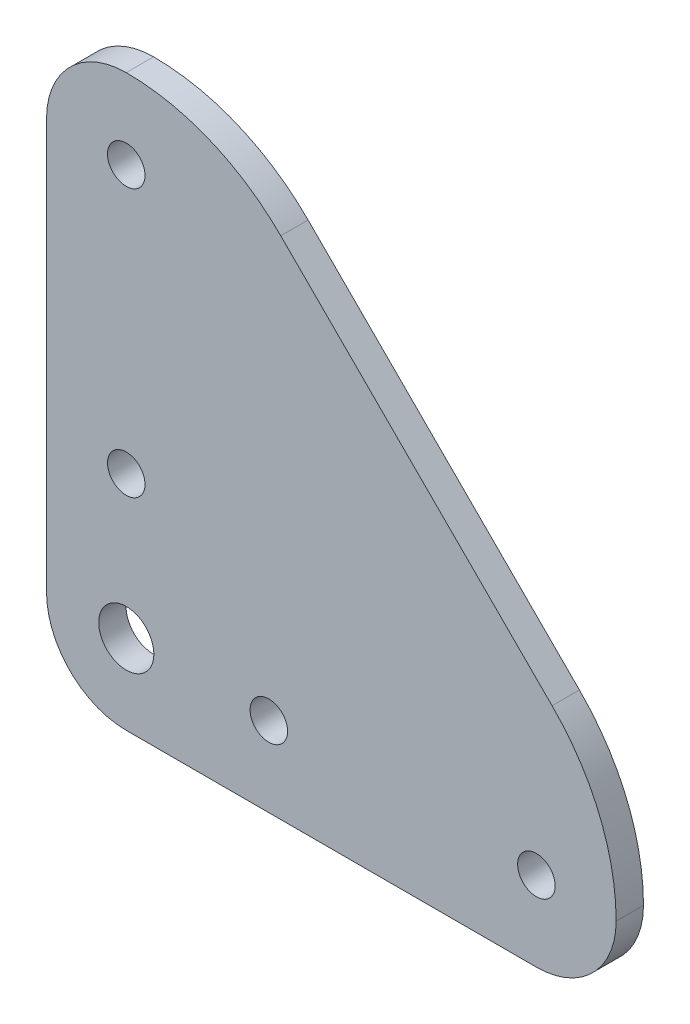
ISO-10303-21;
HEADER;
FILE_DESCRIPTION(('STEP AP214'),'2;1');
FILE_NAME('part.step','',(''),(''),'','','');
FILE_SCHEMA(('AUTOMOTIVE_DESIGN { 1 0 10303 214 1 1 1 1 }'));
ENDSEC;
DATA;
#1=APPLICATION_CONTEXT('core data for automotive mechanical design processes');
#2=APPLICATION_PROTOCOL_DEFINITION('international standard','automotive_design',2000,#1);
#3=PRODUCT_CONTEXT('',#1,'mechanical');
#4=PRODUCT('Part','Part','',(#3));
#5=PRODUCT_RELATED_PRODUCT_CATEGORY('part','',(#4));
#6=PRODUCT_DEFINITION_FORMATION('','',#4);
#7=PRODUCT_DEFINITION_CONTEXT('part definition',#1,'design');
#8=PRODUCT_DEFINITION('design','',#6,#7);
#9=PRODUCT_DEFINITION_SHAPE('','',#8);
#10=(LENGTH_UNIT() NAMED_UNIT(*) SI_UNIT(.MILLI.,.METRE.));
#11=(NAMED_UNIT(*) PLANE_ANGLE_UNIT() SI_UNIT($,.RADIAN.));
#12=(NAMED_UNIT(*) SI_UNIT($,.STERADIAN.) SOLID_ANGLE_UNIT());
#13=UNCERTAINTY_MEASURE_WITH_UNIT(LENGTH_MEASURE(1.E-05),#10,'distance_accuracy_value','');
#14=(GEOMETRIC_REPRESENTATION_CONTEXT(3) GLOBAL_UNCERTAINTY_ASSIGNED_CONTEXT((#13)) GLOBAL_UNIT_ASSIGNED_CONTEXT((#10,
#11,#12)) REPRESENTATION_CONTEXT('',''));
#15=CARTESIAN_POINT('',(0.,0.,0.));
#16=DIRECTION('',(0.,0.,1.));
#17=DIRECTION('',(1.,0.,0.));
#18=AXIS2_PLACEMENT_3D('',#15,#16,#17);
#19=CARTESIAN_POINT('',(0.,0.,3.));
#20=DIRECTION('',(0.,0.,-1.));
#21=DIRECTION('',(-1.,0.,0.));
#22=AXIS2_PLACEMENT_3D('',#19,#20,#21);
#23=PLANE('',#22);
#24=CARTESIAN_POINT('',(52.7884,21.5,3.));
#25=DIRECTION('',(0.,0.,1.));
#26=DIRECTION('',(1.,0.,0.));
#27=AXIS2_PLACEMENT_3D('',#24,#25,#26);
#28=CIRCLE('',#27,4.11875000000001);
#29=CARTESIAN_POINT('',(56.90715,21.5,3.));
#30=VERTEX_POINT('',#29);
#31=EDGE_CURVE('E172',#30,#30,#28,.T.);
#32=ORIENTED_EDGE('',*,*,#31,.F.);
#33=EDGE_LOOP('',(#32));
#34=FACE_BOUND('',#33,.T.);
#35=CARTESIAN_POINT('',(21.5,111.5,3.));
#36=DIRECTION('',(0.,0.,1.));
#37=DIRECTION('',(1.,0.,0.));
#38=AXIS2_PLACEMENT_3D('',#35,#36,#37);
#39=CIRCLE('',#38,4.11875);
#40=CARTESIAN_POINT('',(25.61875,111.5,3.));
#41=VERTEX_POINT('',#40);
#42=EDGE_CURVE('E178',#41,#41,#39,.T.);
#43=ORIENTED_EDGE('',*,*,#42,.F.);
#44=EDGE_LOOP('',(#43));
#45=FACE_BOUND('',#44,.T.);
#46=CARTESIAN_POINT('',(21.5,52.7884,3.));
#47=DIRECTION('',(0.,0.,1.));
#48=DIRECTION('',(1.,0.,0.));
#49=AXIS2_PLACEMENT_3D('',#46,#47,#48);
#50=CIRCLE('',#49,4.11875);
#51=CARTESIAN_POINT('',(25.61875,52.7884,3.));
#52=VERTEX_POINT('',#51);
#53=EDGE_CURVE('E184',#52,#52,#50,.T.);
#54=ORIENTED_EDGE('',*,*,#53,.F.);
#55=EDGE_LOOP('',(#54));
#56=FACE_BOUND('',#55,.T.);
#57=CARTESIAN_POINT('',(111.5,21.5,3.));
#58=DIRECTION('',(0.,0.,1.));
#59=DIRECTION('',(1.,0.,0.));
#60=AXIS2_PLACEMENT_3D('',#57,#58,#59);
#61=CIRCLE('',#60,4.11875000000001);
#62=CARTESIAN_POINT('',(115.61875,21.5,3.));
#63=VERTEX_POINT('',#62);
#64=EDGE_CURVE('E190',#63,#63,#61,.T.);
#65=ORIENTED_EDGE('',*,*,#64,.F.);
#66=EDGE_LOOP('',(#65));
#67=FACE_BOUND('',#66,.T.);
#68=CARTESIAN_POINT('',(21.5,21.5,3.));
#69=DIRECTION('',(0.,0.,1.));
#70=DIRECTION('',(1.,0.,0.));
#71=AXIS2_PLACEMENT_3D('',#68,#69,#70);
#72=CIRCLE('',#71,6.05);
#73=CARTESIAN_POINT('',(27.55,21.5,3.));
#74=VERTEX_POINT('',#73);
#75=EDGE_CURVE('E11',#74,#74,#72,.T.);
#76=ORIENTED_EDGE('',*,*,#75,.F.);
#77=EDGE_LOOP('',(#76));
#78=FACE_BOUND('',#77,.T.);
#79=CARTESIAN_POINT('',(111.5,21.5,3.));
#80=DIRECTION('',(0.,0.,1.));
#81=DIRECTION('',(1.,0.,0.));
#82=AXIS2_PLACEMENT_3D('',#79,#80,#81);
#83=CIRCLE('',#82,17.5);
#84=CARTESIAN_POINT('',(111.5,4.00000000000001,3.));
#85=VERTEX_POINT('',#84);
#86=CARTESIAN_POINT('',(128.999999939322,21.4985426940124,3.));
#87=VERTEX_POINT('',#86);
#88=EDGE_CURVE('E140',#85,#87,#83,.T.);
#89=ORIENTED_EDGE('',*,*,#88,.T.);
#90=CARTESIAN_POINT('',(81.0000147151093,21.4608800414897,3.));
#91=DIRECTION('',(0.,0.,1.));
#92=DIRECTION('',(1.,0.,0.));
#93=AXIS2_PLACEMENT_3D('',#90,#91,#92);
#94=CIRCLE('',#93,48.);
#95=CARTESIAN_POINT('',(114.941140212064,55.402005538444,3.));
#96=VERTEX_POINT('',#95);
#97=EDGE_CURVE('E143',#87,#96,#94,.T.);
#98=ORIENTED_EDGE('',*,*,#97,.T.);
#99=DIRECTION('',(-0.707106781186547,0.707106781186548,0.));
#100=VECTOR('',#99,1.);
#101=CARTESIAN_POINT('',(114.941140212064,55.402005538444,3.));
#102=LINE('',#101,#100);
#103=CARTESIAN_POINT('',(55.402005538444,114.941140212064,3.));
#104=VERTEX_POINT('',#103);
#105=EDGE_CURVE('E54',#96,#104,#102,.T.);
#106=ORIENTED_EDGE('',*,*,#105,.T.);
#107=CARTESIAN_POINT('',(21.4608800414897,81.0000147151093,3.));
#108=DIRECTION('',(0.,0.,1.));
#109=DIRECTION('',(1.,0.,0.));
#110=AXIS2_PLACEMENT_3D('',#107,#108,#109);
#111=CIRCLE('',#110,48.);
#112=CARTESIAN_POINT('',(21.4985426940171,128.999999939322,3.));
#113=VERTEX_POINT('',#112);
#114=EDGE_CURVE('E111',#104,#113,#111,.T.);
#115=ORIENTED_EDGE('',*,*,#114,.T.);
#116=CARTESIAN_POINT('',(21.5,111.5,3.));
#117=DIRECTION('',(0.,0.,1.));
#118=DIRECTION('',(1.,0.,0.));
#119=AXIS2_PLACEMENT_3D('',#116,#117,#118);
#120=CIRCLE('',#119,17.5);
#121=CARTESIAN_POINT('',(4.,111.5,3.));
#122=VERTEX_POINT('',#121);
#123=EDGE_CURVE('E148',#113,#122,#120,.T.);
#124=ORIENTED_EDGE('',*,*,#123,.T.);
#125=DIRECTION('',(0.,-1.,0.));
#126=VECTOR('',#125,1.);
#127=CARTESIAN_POINT('',(4.,111.5,3.));
#128=LINE('',#127,#126);
#129=CARTESIAN_POINT('',(4.,21.5,3.));
#130=VERTEX_POINT('',#129);
#131=EDGE_CURVE('E151',#122,#130,#128,.T.);
#132=ORIENTED_EDGE('',*,*,#131,.T.);
#133=CARTESIAN_POINT('',(21.5,21.5,3.));
#134=DIRECTION('',(0.,0.,1.));
#135=DIRECTION('',(1.,0.,0.));
#136=AXIS2_PLACEMENT_3D('',#133,#134,#135);
#137=CIRCLE('',#136,17.5);
#138=CARTESIAN_POINT('',(21.5,4.,3.));
#139=VERTEX_POINT('',#138);
#140=EDGE_CURVE('E154',#130,#139,#137,.T.);
#141=ORIENTED_EDGE('',*,*,#140,.T.);
#142=DIRECTION('',(1.,0.,0.));
#143=VECTOR('',#142,1.);
#144=CARTESIAN_POINT('',(21.5,4.,3.));
#145=LINE('',#144,#143);
#146=EDGE_CURVE('E157',#139,#85,#145,.T.);
#147=ORIENTED_EDGE('',*,*,#146,.T.);
#148=EDGE_LOOP('',(#89,#98,#106,#115,#124,#132,#141,#147));
#149=FACE_BOUND('',#148,.T.);
#150=ADVANCED_FACE('F39',(#34,#45,#56,#67,#78,#149),#23,.F.);
#151=CARTESIAN_POINT('',(0.,0.,-3.));
#152=DIRECTION('',(0.,0.,-1.));
#153=DIRECTION('',(-1.,0.,0.));
#154=AXIS2_PLACEMENT_3D('',#151,#152,#153);
#155=PLANE('',#154);
#156=CARTESIAN_POINT('',(52.7884,21.5,-3.));
#157=DIRECTION('',(0.,0.,1.));
#158=DIRECTION('',(1.,0.,0.));
#159=AXIS2_PLACEMENT_3D('',#156,#157,#158);
#160=CIRCLE('',#159,4.11875000000001);
#161=CARTESIAN_POINT('',(56.90715,21.5,-3.));
#162=VERTEX_POINT('',#161);
#163=EDGE_CURVE('E162',#162,#162,#160,.T.);
#164=ORIENTED_EDGE('',*,*,#163,.T.);
#165=EDGE_LOOP('',(#164));
#166=FACE_BOUND('',#165,.T.);
#167=CARTESIAN_POINT('',(21.5,52.7884,-3.));
#168=DIRECTION('',(0.,0.,1.));
#169=DIRECTION('',(1.,0.,0.));
#170=AXIS2_PLACEMENT_3D('',#167,#168,#169);
#171=CIRCLE('',#170,4.11875);
#172=CARTESIAN_POINT('',(25.61875,52.7884,-3.));
#173=VERTEX_POINT('',#172);
#174=EDGE_CURVE('E181',#173,#173,#171,.T.);
#175=ORIENTED_EDGE('',*,*,#174,.T.);
#176=EDGE_LOOP('',(#175));
#177=FACE_BOUND('',#176,.T.);
#178=CARTESIAN_POINT('',(21.5,21.5,-3.));
#179=DIRECTION('',(0.,0.,1.));
#180=DIRECTION('',(1.,0.,0.));
#181=AXIS2_PLACEMENT_3D('',#178,#179,#180);
#182=CIRCLE('',#181,6.05);
#183=CARTESIAN_POINT('',(27.55,21.5,-3.));
#184=VERTEX_POINT('',#183);
#185=EDGE_CURVE('E43',#184,#184,#182,.T.);
#186=ORIENTED_EDGE('',*,*,#185,.T.);
#187=EDGE_LOOP('',(#186));
#188=FACE_BOUND('',#187,.T.);
#189=CARTESIAN_POINT('',(111.5,21.5,-3.));
#190=DIRECTION('',(0.,0.,1.));
#191=DIRECTION('',(1.,0.,0.));
#192=AXIS2_PLACEMENT_3D('',#189,#190,#191);
#193=CIRCLE('',#192,4.11875000000001);
#194=CARTESIAN_POINT('',(115.61875,21.5,-3.));
#195=VERTEX_POINT('',#194);
#196=EDGE_CURVE('E187',#195,#195,#193,.T.);
#197=ORIENTED_EDGE('',*,*,#196,.T.);
#198=EDGE_LOOP('',(#197));
#199=FACE_BOUND('',#198,.T.);
#200=CARTESIAN_POINT('',(21.5,111.5,-3.));
#201=DIRECTION('',(0.,0.,1.));
#202=DIRECTION('',(1.,0.,0.));
#203=AXIS2_PLACEMENT_3D('',#200,#201,#202);
#204=CIRCLE('',#203,4.11875);
#205=CARTESIAN_POINT('',(25.61875,111.5,-3.));
#206=VERTEX_POINT('',#205);
#207=EDGE_CURVE('E175',#206,#206,#204,.T.);
#208=ORIENTED_EDGE('',*,*,#207,.T.);
#209=EDGE_LOOP('',(#208));
#210=FACE_BOUND('',#209,.T.);
#211=CARTESIAN_POINT('',(81.0000147151093,21.4608800414897,-3.));
#212=DIRECTION('',(0.,0.,1.));
#213=DIRECTION('',(1.,0.,0.));
#214=AXIS2_PLACEMENT_3D('',#211,#212,#213);
#215=CIRCLE('',#214,48.);
#216=CARTESIAN_POINT('',(128.999999939322,21.4985426940124,-3.));
#217=VERTEX_POINT('',#216);
#218=CARTESIAN_POINT('',(114.941140212064,55.402005538444,-3.));
#219=VERTEX_POINT('',#218);
#220=EDGE_CURVE('E121',#217,#219,#215,.T.);
#221=ORIENTED_EDGE('',*,*,#220,.F.);
#222=CARTESIAN_POINT('',(111.5,21.5,-3.));
#223=DIRECTION('',(0.,0.,1.));
#224=DIRECTION('',(1.,0.,0.));
#225=AXIS2_PLACEMENT_3D('',#222,#223,#224);
#226=CIRCLE('',#225,17.5);
#227=CARTESIAN_POINT('',(111.5,4.00000000000001,-3.));
#228=VERTEX_POINT('',#227);
#229=EDGE_CURVE('E62',#228,#217,#226,.T.);
#230=ORIENTED_EDGE('',*,*,#229,.F.);
#231=DIRECTION('',(1.,0.,0.));
#232=VECTOR('',#231,1.);
#233=CARTESIAN_POINT('',(21.5,4.,-3.));
#234=LINE('',#233,#232);
#235=CARTESIAN_POINT('',(21.5,4.,-3.));
#236=VERTEX_POINT('',#235);
#237=EDGE_CURVE('E136',#236,#228,#234,.T.);
#238=ORIENTED_EDGE('',*,*,#237,.F.);
#239=CARTESIAN_POINT('',(21.5,21.5,-3.));
#240=DIRECTION('',(0.,0.,1.));
#241=DIRECTION('',(1.,0.,0.));
#242=AXIS2_PLACEMENT_3D('',#239,#240,#241);
#243=CIRCLE('',#242,17.5);
#244=CARTESIAN_POINT('',(4.,21.5,-3.));
#245=VERTEX_POINT('',#244);
#246=EDGE_CURVE('E133',#245,#236,#243,.T.);
#247=ORIENTED_EDGE('',*,*,#246,.F.);
#248=DIRECTION('',(0.,-1.,0.));
#249=VECTOR('',#248,1.);
#250=CARTESIAN_POINT('',(4.,111.5,-3.));
#251=LINE('',#250,#249);
#252=CARTESIAN_POINT('',(4.,111.5,-3.));
#253=VERTEX_POINT('',#252);
#254=EDGE_CURVE('E127',#253,#245,#251,.T.);
#255=ORIENTED_EDGE('',*,*,#254,.F.);
#256=CARTESIAN_POINT('',(21.5,111.5,-3.));
#257=DIRECTION('',(0.,0.,1.));
#258=DIRECTION('',(1.,0.,0.));
#259=AXIS2_PLACEMENT_3D('',#256,#257,#258);
#260=CIRCLE('',#259,17.5);
#261=CARTESIAN_POINT('',(21.4985426940171,128.999999939322,-3.));
#262=VERTEX_POINT('',#261);
#263=EDGE_CURVE('E125',#262,#253,#260,.T.);
#264=ORIENTED_EDGE('',*,*,#263,.F.);
#265=CARTESIAN_POINT('',(21.4608800414897,81.0000147151093,-3.));
#266=DIRECTION('',(0.,0.,1.));
#267=DIRECTION('',(1.,0.,0.));
#268=AXIS2_PLACEMENT_3D('',#265,#266,#267);
#269=CIRCLE('',#268,48.);
#270=CARTESIAN_POINT('',(55.402005538444,114.941140212064,-3.));
#271=VERTEX_POINT('',#270);
#272=EDGE_CURVE('E108',#271,#262,#269,.T.);
#273=ORIENTED_EDGE('',*,*,#272,.F.);
#274=DIRECTION('',(-0.707106781186547,0.707106781186548,0.));
#275=VECTOR('',#274,1.);
#276=CARTESIAN_POINT('',(114.941140212064,55.402005538444,-3.));
#277=LINE('',#276,#275);
#278=EDGE_CURVE('E116',#219,#271,#277,.T.);
#279=ORIENTED_EDGE('',*,*,#278,.F.);
#280=EDGE_LOOP('',(#221,#230,#238,#247,#255,#264,#273,#279));
#281=FACE_BOUND('',#280,.T.);
#282=ADVANCED_FACE('F41',(#166,#177,#188,#199,#210,#281),#155,.T.);
#283=CARTESIAN_POINT('',(21.5,21.5,3.));
#284=DIRECTION('',(0.,0.,-1.));
#285=DIRECTION('',(-1.,0.,0.));
#286=AXIS2_PLACEMENT_3D('',#283,#284,#285);
#287=CYLINDRICAL_SURFACE('',#286,6.05);
#288=ORIENTED_EDGE('',*,*,#75,.T.);
#289=EDGE_LOOP('',(#288));
#290=FACE_BOUND('',#289,.T.);
#291=ORIENTED_EDGE('',*,*,#185,.F.);
#292=EDGE_LOOP('',(#291));
#293=FACE_BOUND('',#292,.T.);
#294=ADVANCED_FACE('F201',(#290,#293),#287,.F.);
#295=CARTESIAN_POINT('',(111.5,21.5,3.));
#296=DIRECTION('',(0.,0.,-1.));
#297=DIRECTION('',(-1.,0.,0.));
#298=AXIS2_PLACEMENT_3D('',#295,#296,#297);
#299=CYLINDRICAL_SURFACE('',#298,4.11875000000001);
#300=ORIENTED_EDGE('',*,*,#64,.T.);
#301=EDGE_LOOP('',(#300));
#302=FACE_BOUND('',#301,.T.);
#303=ORIENTED_EDGE('',*,*,#196,.F.);
#304=EDGE_LOOP('',(#303));
#305=FACE_BOUND('',#304,.T.);
#306=ADVANCED_FACE('F198',(#302,#305),#299,.F.);
#307=CARTESIAN_POINT('',(21.5,52.7884,3.));
#308=DIRECTION('',(0.,0.,-1.));
#309=DIRECTION('',(-1.,0.,0.));
#310=AXIS2_PLACEMENT_3D('',#307,#308,#309);
#311=CYLINDRICAL_SURFACE('',#310,4.11875);
#312=ORIENTED_EDGE('',*,*,#53,.T.);
#313=EDGE_LOOP('',(#312));
#314=FACE_BOUND('',#313,.T.);
#315=ORIENTED_EDGE('',*,*,#174,.F.);
#316=EDGE_LOOP('',(#315));
#317=FACE_BOUND('',#316,.T.);
#318=ADVANCED_FACE('F200',(#314,#317),#311,.F.);
#319=CARTESIAN_POINT('',(21.5,111.5,3.));
#320=DIRECTION('',(0.,0.,-1.));
#321=DIRECTION('',(-1.,0.,0.));
#322=AXIS2_PLACEMENT_3D('',#319,#320,#321);
#323=CYLINDRICAL_SURFACE('',#322,4.11875);
#324=ORIENTED_EDGE('',*,*,#42,.T.);
#325=EDGE_LOOP('',(#324));
#326=FACE_BOUND('',#325,.T.);
#327=ORIENTED_EDGE('',*,*,#207,.F.);
#328=EDGE_LOOP('',(#327));
#329=FACE_BOUND('',#328,.T.);
#330=ADVANCED_FACE('F208',(#326,#329),#323,.F.);
#331=CARTESIAN_POINT('',(52.7884,21.5,3.));
#332=DIRECTION('',(0.,0.,-1.));
#333=DIRECTION('',(-1.,0.,0.));
#334=AXIS2_PLACEMENT_3D('',#331,#332,#333);
#335=CYLINDRICAL_SURFACE('',#334,4.11875000000001);
#336=ORIENTED_EDGE('',*,*,#31,.T.);
#337=EDGE_LOOP('',(#336));
#338=FACE_BOUND('',#337,.T.);
#339=ORIENTED_EDGE('',*,*,#163,.F.);
#340=EDGE_LOOP('',(#339));
#341=FACE_BOUND('',#340,.T.);
#342=ADVANCED_FACE('F266',(#338,#341),#335,.F.);
#343=CARTESIAN_POINT('',(111.5,21.5,-3.));
#344=DIRECTION('',(0.,0.,1.));
#345=DIRECTION('',(1.,0.,0.));
#346=AXIS2_PLACEMENT_3D('',#343,#344,#345);
#347=CYLINDRICAL_SURFACE('',#346,17.5);
#348=ORIENTED_EDGE('',*,*,#88,.F.);
#349=DIRECTION('',(0.,0.,1.));
#350=VECTOR('',#349,1.);
#351=CARTESIAN_POINT('',(111.5,4.00000000000001,-3.));
#352=LINE('',#351,#350);
#353=EDGE_CURVE('E160',#228,#85,#352,.T.);
#354=ORIENTED_EDGE('',*,*,#353,.F.);
#355=ORIENTED_EDGE('',*,*,#229,.T.);
#356=DIRECTION('',(0.,0.,1.));
#357=VECTOR('',#356,1.);
#358=CARTESIAN_POINT('',(128.999999939322,21.4985426940124,-3.));
#359=LINE('',#358,#357);
#360=EDGE_CURVE('E139',#217,#87,#359,.T.);
#361=ORIENTED_EDGE('',*,*,#360,.T.);
#362=EDGE_LOOP('',(#348,#354,#355,#361));
#363=FACE_BOUND('',#362,.T.);
#364=ADVANCED_FACE('F233',(#363),#347,.T.);
#365=CARTESIAN_POINT('',(21.5,4.,-3.));
#366=DIRECTION('',(0.,-1.,0.));
#367=DIRECTION('',(1.,0.,0.));
#368=AXIS2_PLACEMENT_3D('',#365,#366,#367);
#369=PLANE('',#368);
#370=ORIENTED_EDGE('',*,*,#146,.F.);
#371=DIRECTION('',(0.,0.,1.));
#372=VECTOR('',#371,1.);
#373=CARTESIAN_POINT('',(21.5,4.,-3.));
#374=LINE('',#373,#372);
#375=EDGE_CURVE('E163',#236,#139,#374,.T.);
#376=ORIENTED_EDGE('',*,*,#375,.F.);
#377=ORIENTED_EDGE('',*,*,#237,.T.);
#378=ORIENTED_EDGE('',*,*,#353,.T.);
#379=EDGE_LOOP('',(#370,#376,#377,#378));
#380=FACE_BOUND('',#379,.T.);
#381=ADVANCED_FACE('F240',(#380),#369,.T.);
#382=CARTESIAN_POINT('',(21.5,21.5,-3.));
#383=DIRECTION('',(0.,0.,1.));
#384=DIRECTION('',(1.,0.,0.));
#385=AXIS2_PLACEMENT_3D('',#382,#383,#384);
#386=CYLINDRICAL_SURFACE('',#385,17.5);
#387=ORIENTED_EDGE('',*,*,#140,.F.);
#388=DIRECTION('',(0.,0.,1.));
#389=VECTOR('',#388,1.);
#390=CARTESIAN_POINT('',(4.,21.5,-3.));
#391=LINE('',#390,#389);
#392=EDGE_CURVE('E165',#245,#130,#391,.T.);
#393=ORIENTED_EDGE('',*,*,#392,.F.);
#394=ORIENTED_EDGE('',*,*,#246,.T.);
#395=ORIENTED_EDGE('',*,*,#375,.T.);
#396=EDGE_LOOP('',(#387,#393,#394,#395));
#397=FACE_BOUND('',#396,.T.);
#398=ADVANCED_FACE('F243',(#397),#386,.T.);
#399=CARTESIAN_POINT('',(4.,111.5,-3.));
#400=DIRECTION('',(-1.,0.,0.));
#401=DIRECTION('',(0.,-1.,0.));
#402=AXIS2_PLACEMENT_3D('',#399,#400,#401);
#403=PLANE('',#402);
#404=ORIENTED_EDGE('',*,*,#131,.F.);
#405=DIRECTION('',(0.,0.,1.));
#406=VECTOR('',#405,1.);
#407=CARTESIAN_POINT('',(4.,111.5,-3.));
#408=LINE('',#407,#406);
#409=EDGE_CURVE('E167',#253,#122,#408,.T.);
#410=ORIENTED_EDGE('',*,*,#409,.F.);
#411=ORIENTED_EDGE('',*,*,#254,.T.);
#412=ORIENTED_EDGE('',*,*,#392,.T.);
#413=EDGE_LOOP('',(#404,#410,#411,#412));
#414=FACE_BOUND('',#413,.T.);
#415=ADVANCED_FACE('F246',(#414),#403,.T.);
#416=CARTESIAN_POINT('',(21.5,111.5,-3.));
#417=DIRECTION('',(0.,0.,1.));
#418=DIRECTION('',(1.,0.,0.));
#419=AXIS2_PLACEMENT_3D('',#416,#417,#418);
#420=CYLINDRICAL_SURFACE('',#419,17.5);
#421=ORIENTED_EDGE('',*,*,#123,.F.);
#422=DIRECTION('',(0.,0.,1.));
#423=VECTOR('',#422,1.);
#424=CARTESIAN_POINT('',(21.4985426940171,128.999999939322,-3.));
#425=LINE('',#424,#423);
#426=EDGE_CURVE('E112',#262,#113,#425,.T.);
#427=ORIENTED_EDGE('',*,*,#426,.F.);
#428=ORIENTED_EDGE('',*,*,#263,.T.);
#429=ORIENTED_EDGE('',*,*,#409,.T.);
#430=EDGE_LOOP('',(#421,#427,#428,#429));
#431=FACE_BOUND('',#430,.T.);
#432=ADVANCED_FACE('F249',(#431),#420,.T.);
#433=CARTESIAN_POINT('',(21.4608800414897,81.0000147151093,-3.));
#434=DIRECTION('',(0.,0.,1.));
#435=DIRECTION('',(1.,0.,0.));
#436=AXIS2_PLACEMENT_3D('',#433,#434,#435);
#437=CYLINDRICAL_SURFACE('',#436,48.);
#438=ORIENTED_EDGE('',*,*,#114,.F.);
#439=DIRECTION('',(0.,0.,1.));
#440=VECTOR('',#439,1.);
#441=CARTESIAN_POINT('',(55.402005538444,114.941140212064,-3.));
#442=LINE('',#441,#440);
#443=EDGE_CURVE('E104',#271,#104,#442,.T.);
#444=ORIENTED_EDGE('',*,*,#443,.F.);
#445=ORIENTED_EDGE('',*,*,#272,.T.);
#446=ORIENTED_EDGE('',*,*,#426,.T.);
#447=EDGE_LOOP('',(#438,#444,#445,#446));
#448=FACE_BOUND('',#447,.T.);
#449=ADVANCED_FACE('F106',(#448),#437,.T.);
#450=CARTESIAN_POINT('',(114.941140212064,55.402005538444,-3.));
#451=DIRECTION('',(0.707106781186548,0.707106781186547,0.));
#452=DIRECTION('',(-0.707106781186547,0.707106781186548,0.));
#453=AXIS2_PLACEMENT_3D('',#450,#451,#452);
#454=PLANE('',#453);
#455=ORIENTED_EDGE('',*,*,#105,.F.);
#456=DIRECTION('',(0.,0.,1.));
#457=VECTOR('',#456,1.);
#458=CARTESIAN_POINT('',(114.941140212064,55.402005538444,-3.));
#459=LINE('',#458,#457);
#460=EDGE_CURVE('E113',#219,#96,#459,.T.);
#461=ORIENTED_EDGE('',*,*,#460,.F.);
#462=ORIENTED_EDGE('',*,*,#278,.T.);
#463=ORIENTED_EDGE('',*,*,#443,.T.);
#464=EDGE_LOOP('',(#455,#461,#462,#463));
#465=FACE_BOUND('',#464,.T.);
#466=ADVANCED_FACE('F117',(#465),#454,.T.);
#467=CARTESIAN_POINT('',(81.0000147151093,21.4608800414897,-3.));
#468=DIRECTION('',(0.,0.,1.));
#469=DIRECTION('',(1.,0.,0.));
#470=AXIS2_PLACEMENT_3D('',#467,#468,#469);
#471=CYLINDRICAL_SURFACE('',#470,48.);
#472=ORIENTED_EDGE('',*,*,#97,.F.);
#473=ORIENTED_EDGE('',*,*,#360,.F.);
#474=ORIENTED_EDGE('',*,*,#220,.T.);
#475=ORIENTED_EDGE('',*,*,#460,.T.);
#476=EDGE_LOOP('',(#472,#473,#474,#475));
#477=FACE_BOUND('',#476,.T.);
#478=ADVANCED_FACE('F235',(#477),#471,.T.);
#479=CLOSED_SHELL('',(#150,#282,#294,#306,#318,#330,#342,#364,#381,#398,#415,#432,#449,#466,#478));
#480=MANIFOLD_SOLID_BREP('B2',#479);
#481=ADVANCED_BREP_SHAPE_REPRESENTATION('',(#18,#480),#14);
#482=SHAPE_DEFINITION_REPRESENTATION(#9,#481);
ENDSEC;
END-ISO-10303-21;
